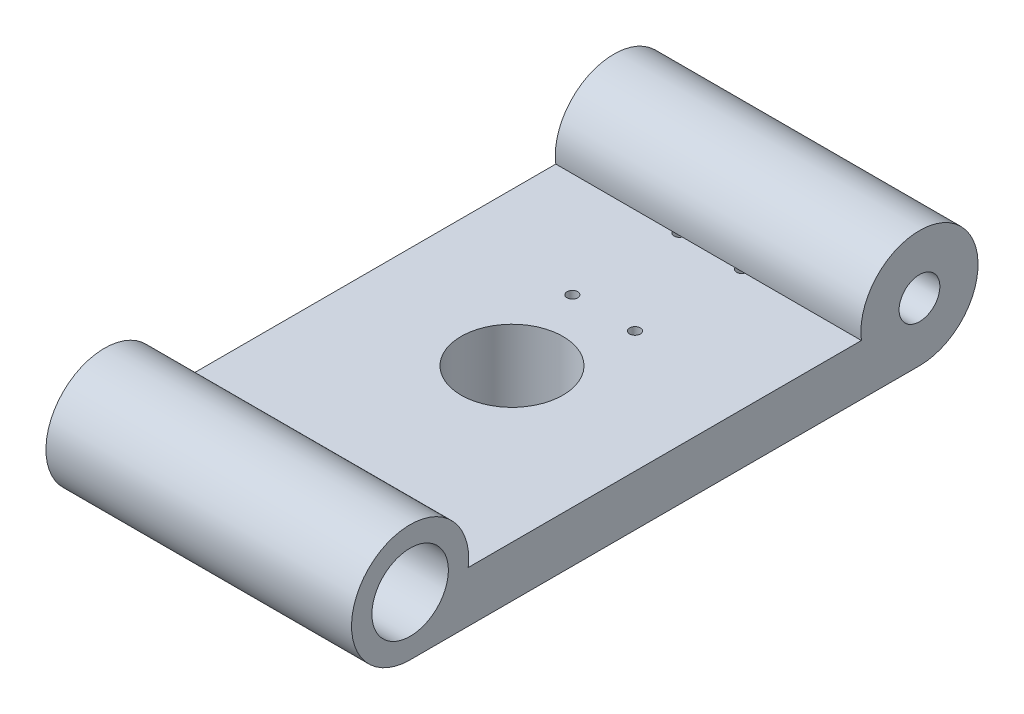
ISO-10303-21;
HEADER;
FILE_DESCRIPTION(('STEP AP214'),'2;1');
FILE_NAME('part.step','',(''),(''),'','','');
FILE_SCHEMA(('AUTOMOTIVE_DESIGN { 1 0 10303 214 1 1 1 1 }'));
ENDSEC;
DATA;
#1=APPLICATION_CONTEXT('core data for automotive mechanical design processes');
#2=APPLICATION_PROTOCOL_DEFINITION('international standard','automotive_design',2000,#1);
#3=PRODUCT_CONTEXT('',#1,'mechanical');
#4=PRODUCT('Part','Part','',(#3));
#5=PRODUCT_RELATED_PRODUCT_CATEGORY('part','',(#4));
#6=PRODUCT_DEFINITION_FORMATION('','',#4);
#7=PRODUCT_DEFINITION_CONTEXT('part definition',#1,'design');
#8=PRODUCT_DEFINITION('design','',#6,#7);
#9=PRODUCT_DEFINITION_SHAPE('','',#8);
#10=(LENGTH_UNIT() NAMED_UNIT(*) SI_UNIT(.MILLI.,.METRE.));
#11=(NAMED_UNIT(*) PLANE_ANGLE_UNIT() SI_UNIT($,.RADIAN.));
#12=(NAMED_UNIT(*) SI_UNIT($,.STERADIAN.) SOLID_ANGLE_UNIT());
#13=UNCERTAINTY_MEASURE_WITH_UNIT(LENGTH_MEASURE(1.E-05),#10,'distance_accuracy_value','');
#14=(GEOMETRIC_REPRESENTATION_CONTEXT(3) GLOBAL_UNCERTAINTY_ASSIGNED_CONTEXT((#13)) GLOBAL_UNIT_ASSIGNED_CONTEXT((#10,
#11,#12)) REPRESENTATION_CONTEXT('',''));
#15=CARTESIAN_POINT('',(0.,0.,0.));
#16=DIRECTION('',(0.,0.,1.));
#17=DIRECTION('',(1.,0.,0.));
#18=AXIS2_PLACEMENT_3D('',#15,#16,#17);
#19=CARTESIAN_POINT('',(30.,-11.5,0.));
#20=DIRECTION('',(0.,1.,0.));
#21=DIRECTION('',(0.,0.,1.));
#22=AXIS2_PLACEMENT_3D('',#19,#20,#21);
#23=PLANE('',#22);
#24=CARTESIAN_POINT('',(-6.15,-11.5,-39.));
#25=DIRECTION('',(0.,-1.,0.));
#26=DIRECTION('',(0.,0.,-1.));
#27=AXIS2_PLACEMENT_3D('',#24,#25,#26);
#28=CIRCLE('',#27,1.05);
#29=CARTESIAN_POINT('',(-6.15,-11.5,-40.05));
#30=VERTEX_POINT('',#29);
#31=EDGE_CURVE('E214',#30,#30,#28,.T.);
#32=ORIENTED_EDGE('',*,*,#31,.F.);
#33=EDGE_LOOP('',(#32));
#34=FACE_BOUND('',#33,.T.);
#35=CARTESIAN_POINT('',(6.15,-11.5,-18.));
#36=DIRECTION('',(0.,-1.,0.));
#37=DIRECTION('',(0.,0.,-1.));
#38=AXIS2_PLACEMENT_3D('',#35,#36,#37);
#39=CIRCLE('',#38,1.05);
#40=CARTESIAN_POINT('',(6.15,-11.5,-19.05));
#41=VERTEX_POINT('',#40);
#42=EDGE_CURVE('E108',#41,#41,#39,.T.);
#43=ORIENTED_EDGE('',*,*,#42,.F.);
#44=EDGE_LOOP('',(#43));
#45=FACE_BOUND('',#44,.T.);
#46=CARTESIAN_POINT('',(6.15,-11.5,-39.));
#47=DIRECTION('',(0.,-1.,0.));
#48=DIRECTION('',(0.,0.,-1.));
#49=AXIS2_PLACEMENT_3D('',#46,#47,#48);
#50=CIRCLE('',#49,1.05);
#51=CARTESIAN_POINT('',(6.15,-11.5,-40.05));
#52=VERTEX_POINT('',#51);
#53=EDGE_CURVE('E99',#52,#52,#50,.T.);
#54=ORIENTED_EDGE('',*,*,#53,.F.);
#55=EDGE_LOOP('',(#54));
#56=FACE_BOUND('',#55,.T.);
#57=CARTESIAN_POINT('',(-6.15,-11.5,-18.));
#58=DIRECTION('',(0.,-1.,0.));
#59=DIRECTION('',(0.,0.,-1.));
#60=AXIS2_PLACEMENT_3D('',#57,#58,#59);
#61=CIRCLE('',#60,1.05);
#62=CARTESIAN_POINT('',(-6.15,-11.5,-19.05));
#63=VERTEX_POINT('',#62);
#64=EDGE_CURVE('E199',#63,#63,#61,.T.);
#65=ORIENTED_EDGE('',*,*,#64,.F.);
#66=EDGE_LOOP('',(#65));
#67=FACE_BOUND('',#66,.T.);
#68=CARTESIAN_POINT('',(0.,-11.5,0.));
#69=DIRECTION('',(0.,-1.,0.));
#70=DIRECTION('',(0.,0.,-1.));
#71=AXIS2_PLACEMENT_3D('',#68,#69,#70);
#72=CIRCLE('',#71,15.);
#73=CARTESIAN_POINT('',(0.,-11.5,-15.));
#74=VERTEX_POINT('',#73);
#75=EDGE_CURVE('E164',#74,#74,#72,.T.);
#76=ORIENTED_EDGE('',*,*,#75,.F.);
#77=EDGE_LOOP('',(#76));
#78=FACE_BOUND('',#77,.T.);
#79=DIRECTION('',(0.,0.,-1.));
#80=VECTOR('',#79,1.);
#81=CARTESIAN_POINT('',(-30.,-11.5,0.));
#82=LINE('',#81,#80);
#83=CARTESIAN_POINT('',(-30.,-11.5,50.));
#84=VERTEX_POINT('',#83);
#85=CARTESIAN_POINT('',(-30.,-11.5,-50.));
#86=VERTEX_POINT('',#85);
#87=EDGE_CURVE('E152',#84,#86,#82,.T.);
#88=ORIENTED_EDGE('',*,*,#87,.T.);
#89=DIRECTION('',(-1.,0.,0.));
#90=VECTOR('',#89,1.);
#91=CARTESIAN_POINT('',(30.,-11.5,-50.));
#92=LINE('',#91,#90);
#93=CARTESIAN_POINT('',(30.,-11.5,-50.));
#94=VERTEX_POINT('',#93);
#95=EDGE_CURVE('E11',#94,#86,#92,.T.);
#96=ORIENTED_EDGE('',*,*,#95,.F.);
#97=DIRECTION('',(0.,0.,-1.));
#98=VECTOR('',#97,1.);
#99=CARTESIAN_POINT('',(30.,-11.5,0.));
#100=LINE('',#99,#98);
#101=CARTESIAN_POINT('',(30.,-11.5,50.));
#102=VERTEX_POINT('',#101);
#103=EDGE_CURVE('E172',#102,#94,#100,.T.);
#104=ORIENTED_EDGE('',*,*,#103,.F.);
#105=DIRECTION('',(-1.,0.,0.));
#106=VECTOR('',#105,1.);
#107=CARTESIAN_POINT('',(30.,-11.5,50.));
#108=LINE('',#107,#106);
#109=EDGE_CURVE('E132',#102,#84,#108,.T.);
#110=ORIENTED_EDGE('',*,*,#109,.T.);
#111=EDGE_LOOP('',(#88,#96,#104,#110));
#112=FACE_BOUND('',#111,.T.);
#113=ADVANCED_FACE('F41',(#34,#45,#56,#67,#78,#112),#23,.F.);
#114=CARTESIAN_POINT('',(30.,0.,-50.));
#115=DIRECTION('',(-1.,0.,0.));
#116=DIRECTION('',(0.,0.,1.));
#117=AXIS2_PLACEMENT_3D('',#114,#115,#116);
#118=CYLINDRICAL_SURFACE('',#117,11.5);
#119=CARTESIAN_POINT('',(-30.,0.,-50.));
#120=DIRECTION('',(1.,0.,0.));
#121=DIRECTION('',(0.,0.,-1.));
#122=AXIS2_PLACEMENT_3D('',#119,#120,#121);
#123=CIRCLE('',#122,11.5);
#124=CARTESIAN_POINT('',(-30.,-1.5,-38.5982457490086));
#125=VERTEX_POINT('',#124);
#126=EDGE_CURVE('E149',#86,#125,#123,.T.);
#127=ORIENTED_EDGE('',*,*,#126,.T.);
#128=DIRECTION('',(-1.,0.,0.));
#129=VECTOR('',#128,1.);
#130=CARTESIAN_POINT('',(30.,-1.5,-38.5982457490086));
#131=LINE('',#130,#129);
#132=CARTESIAN_POINT('',(-7.12009974838176,-1.5,-38.5982457490086));
#133=VERTEX_POINT('',#132);
#134=EDGE_CURVE('E123',#133,#125,#131,.T.);
#135=ORIENTED_EDGE('',*,*,#134,.F.);
#136=CARTESIAN_POINT('',(-5.17990025161823,-1.5,-38.5982457490086));
#137=VERTEX_POINT('',#136);
#138=EDGE_CURVE('E126',#137,#133,#131,.T.);
#139=ORIENTED_EDGE('',*,*,#138,.F.);
#140=CARTESIAN_POINT('',(5.17990025161824,-1.5,-38.5982457490086));
#141=VERTEX_POINT('',#140);
#142=EDGE_CURVE('E115',#141,#137,#131,.T.);
#143=ORIENTED_EDGE('',*,*,#142,.F.);
#144=CARTESIAN_POINT('',(7.12009974838177,-1.5,-38.5982457490086));
#145=VERTEX_POINT('',#144);
#146=EDGE_CURVE('E95',#145,#141,#131,.T.);
#147=ORIENTED_EDGE('',*,*,#146,.F.);
#148=CARTESIAN_POINT('',(30.,-1.5,-38.5982457490086));
#149=VERTEX_POINT('',#148);
#150=EDGE_CURVE('E50',#149,#145,#131,.T.);
#151=ORIENTED_EDGE('',*,*,#150,.F.);
#152=CARTESIAN_POINT('',(30.,0.,-50.));
#153=DIRECTION('',(1.,0.,0.));
#154=DIRECTION('',(0.,0.,-1.));
#155=AXIS2_PLACEMENT_3D('',#152,#153,#154);
#156=CIRCLE('',#155,11.5);
#157=EDGE_CURVE('E169',#94,#149,#156,.T.);
#158=ORIENTED_EDGE('',*,*,#157,.F.);
#159=ORIENTED_EDGE('',*,*,#95,.T.);
#160=EDGE_LOOP('',(#127,#135,#139,#143,#147,#151,#158,#159));
#161=FACE_BOUND('',#160,.T.);
#162=ADVANCED_FACE('F112',(#161),#118,.T.);
#163=CARTESIAN_POINT('',(30.,-1.5,0.));
#164=DIRECTION('',(0.,1.,0.));
#165=DIRECTION('',(0.,0.,1.));
#166=AXIS2_PLACEMENT_3D('',#163,#164,#165);
#167=PLANE('',#166);
#168=CARTESIAN_POINT('',(-6.15,-1.5,-39.));
#169=DIRECTION('',(0.,-1.,0.));
#170=DIRECTION('',(0.,0.,-1.));
#171=AXIS2_PLACEMENT_3D('',#168,#169,#170);
#172=CIRCLE('',#171,1.05);
#173=EDGE_CURVE('E203',#137,#133,#172,.T.);
#174=ORIENTED_EDGE('',*,*,#173,.T.);
#175=ORIENTED_EDGE('',*,*,#134,.T.);
#176=DIRECTION('',(0.,0.,-1.));
#177=VECTOR('',#176,1.);
#178=CARTESIAN_POINT('',(-30.,-1.5,0.));
#179=LINE('',#178,#177);
#180=CARTESIAN_POINT('',(-30.,-1.5,38.5982457490086));
#181=VERTEX_POINT('',#180);
#182=EDGE_CURVE('E145',#181,#125,#179,.T.);
#183=ORIENTED_EDGE('',*,*,#182,.F.);
#184=DIRECTION('',(-1.,0.,0.));
#185=VECTOR('',#184,1.);
#186=CARTESIAN_POINT('',(30.,-1.5,38.5982457490086));
#187=LINE('',#186,#185);
#188=CARTESIAN_POINT('',(30.,-1.5,38.5982457490086));
#189=VERTEX_POINT('',#188);
#190=EDGE_CURVE('E127',#189,#181,#187,.T.);
#191=ORIENTED_EDGE('',*,*,#190,.F.);
#192=DIRECTION('',(0.,0.,-1.));
#193=VECTOR('',#192,1.);
#194=CARTESIAN_POINT('',(30.,-1.5,0.));
#195=LINE('',#194,#193);
#196=EDGE_CURVE('E121',#189,#149,#195,.T.);
#197=ORIENTED_EDGE('',*,*,#196,.T.);
#198=ORIENTED_EDGE('',*,*,#150,.T.);
#199=CARTESIAN_POINT('',(6.15,-1.5,-39.));
#200=DIRECTION('',(0.,-1.,0.));
#201=DIRECTION('',(0.,0.,-1.));
#202=AXIS2_PLACEMENT_3D('',#199,#200,#201);
#203=CIRCLE('',#202,1.05);
#204=EDGE_CURVE('E98',#145,#141,#203,.T.);
#205=ORIENTED_EDGE('',*,*,#204,.T.);
#206=ORIENTED_EDGE('',*,*,#142,.T.);
#207=EDGE_LOOP('',(#174,#175,#183,#191,#197,#198,#205,#206));
#208=FACE_BOUND('',#207,.T.);
#209=CARTESIAN_POINT('',(6.15,-1.5,-18.));
#210=DIRECTION('',(0.,-1.,0.));
#211=DIRECTION('',(0.,0.,-1.));
#212=AXIS2_PLACEMENT_3D('',#209,#210,#211);
#213=CIRCLE('',#212,1.05);
#214=CARTESIAN_POINT('',(6.15,-1.5,-19.05));
#215=VERTEX_POINT('',#214);
#216=EDGE_CURVE('E210',#215,#215,#213,.T.);
#217=ORIENTED_EDGE('',*,*,#216,.T.);
#218=EDGE_LOOP('',(#217));
#219=FACE_BOUND('',#218,.T.);
#220=CARTESIAN_POINT('',(-6.15,-1.5,-18.));
#221=DIRECTION('',(0.,-1.,0.));
#222=DIRECTION('',(0.,0.,-1.));
#223=AXIS2_PLACEMENT_3D('',#220,#221,#222);
#224=CIRCLE('',#223,1.05);
#225=CARTESIAN_POINT('',(-6.15,-1.5,-19.05));
#226=VERTEX_POINT('',#225);
#227=EDGE_CURVE('E195',#226,#226,#224,.T.);
#228=ORIENTED_EDGE('',*,*,#227,.T.);
#229=EDGE_LOOP('',(#228));
#230=FACE_BOUND('',#229,.T.);
#231=CARTESIAN_POINT('',(0.,-1.5,0.));
#232=DIRECTION('',(0.,1.,0.));
#233=DIRECTION('',(0.,0.,1.));
#234=AXIS2_PLACEMENT_3D('',#231,#232,#233);
#235=CIRCLE('',#234,10.);
#236=CARTESIAN_POINT('',(0.,-1.5,10.));
#237=VERTEX_POINT('',#236);
#238=EDGE_CURVE('E191',#237,#237,#235,.T.);
#239=ORIENTED_EDGE('',*,*,#238,.F.);
#240=EDGE_LOOP('',(#239));
#241=FACE_BOUND('',#240,.T.);
#242=ADVANCED_FACE('F118',(#208,#219,#230,#241),#167,.T.);
#243=CARTESIAN_POINT('',(30.,0.,-50.));
#244=DIRECTION('',(-1.,0.,0.));
#245=DIRECTION('',(0.,0.,1.));
#246=AXIS2_PLACEMENT_3D('',#243,#244,#245);
#247=CYLINDRICAL_SURFACE('',#246,4.00000000000001);
#248=CARTESIAN_POINT('',(30.,0.,-50.));
#249=DIRECTION('',(1.,0.,0.));
#250=DIRECTION('',(0.,0.,-1.));
#251=AXIS2_PLACEMENT_3D('',#248,#249,#250);
#252=CIRCLE('',#251,4.00000000000001);
#253=CARTESIAN_POINT('',(30.,0.,-46.));
#254=VERTEX_POINT('',#253);
#255=EDGE_CURVE('E176',#254,#254,#252,.T.);
#256=CARTESIAN_POINT('',(-30.,0.,-50.));
#257=DIRECTION('',(1.,0.,0.));
#258=DIRECTION('',(0.,0.,-1.));
#259=AXIS2_PLACEMENT_3D('',#256,#257,#258);
#260=CIRCLE('',#259,4.00000000000001);
#261=CARTESIAN_POINT('',(-30.,0.,-46.));
#262=VERTEX_POINT('',#261);
#263=EDGE_CURVE('E156',#262,#262,#260,.T.);
#264=CARTESIAN_POINT('',(30.,0.,-46.));
#265=CARTESIAN_POINT('',(29.375,0.,-46.));
#266=CARTESIAN_POINT('',(28.75,0.,-46.));
#267=CARTESIAN_POINT('',(27.5,0.,-46.));
#268=CARTESIAN_POINT('',(26.875,0.,-46.));
#269=CARTESIAN_POINT('',(25.625,0.,-46.));
#270=CARTESIAN_POINT('',(25.,0.,-46.));
#271=CARTESIAN_POINT('',(23.75,0.,-46.));
#272=CARTESIAN_POINT('',(23.125,0.,-46.));
#273=CARTESIAN_POINT('',(21.875,0.,-46.));
#274=CARTESIAN_POINT('',(21.25,0.,-46.));
#275=CARTESIAN_POINT('',(20.,0.,-46.));
#276=CARTESIAN_POINT('',(19.375,0.,-46.));
#277=CARTESIAN_POINT('',(18.125,0.,-46.));
#278=CARTESIAN_POINT('',(17.5,0.,-46.));
#279=CARTESIAN_POINT('',(16.25,0.,-46.));
#280=CARTESIAN_POINT('',(15.625,0.,-46.));
#281=CARTESIAN_POINT('',(14.375,0.,-46.));
#282=CARTESIAN_POINT('',(13.75,0.,-46.));
#283=CARTESIAN_POINT('',(12.5,0.,-46.));
#284=CARTESIAN_POINT('',(11.875,0.,-46.));
#285=CARTESIAN_POINT('',(10.625,0.,-46.));
#286=CARTESIAN_POINT('',(10.,0.,-46.));
#287=CARTESIAN_POINT('',(8.75,0.,-46.));
#288=CARTESIAN_POINT('',(8.125,0.,-46.));
#289=CARTESIAN_POINT('',(6.875,0.,-46.));
#290=CARTESIAN_POINT('',(6.25,0.,-46.));
#291=CARTESIAN_POINT('',(5.,0.,-46.));
#292=CARTESIAN_POINT('',(4.375,0.,-46.));
#293=CARTESIAN_POINT('',(3.125,0.,-46.));
#294=CARTESIAN_POINT('',(2.5,0.,-46.));
#295=CARTESIAN_POINT('',(1.25,0.,-46.));
#296=CARTESIAN_POINT('',(0.624999999999997,0.,-46.));
#297=CARTESIAN_POINT('',(-0.625000000000002,0.,-46.));
#298=CARTESIAN_POINT('',(-1.25,0.,-46.));
#299=CARTESIAN_POINT('',(-2.5,0.,-46.));
#300=CARTESIAN_POINT('',(-3.125,0.,-46.));
#301=CARTESIAN_POINT('',(-4.375,0.,-46.));
#302=CARTESIAN_POINT('',(-5.,0.,-46.));
#303=CARTESIAN_POINT('',(-6.25,0.,-46.));
#304=CARTESIAN_POINT('',(-6.875,0.,-46.));
#305=CARTESIAN_POINT('',(-8.125,0.,-46.));
#306=CARTESIAN_POINT('',(-8.75,0.,-46.));
#307=CARTESIAN_POINT('',(-10.,0.,-46.));
#308=CARTESIAN_POINT('',(-10.625,0.,-46.));
#309=CARTESIAN_POINT('',(-11.875,0.,-46.));
#310=CARTESIAN_POINT('',(-12.5,0.,-46.));
#311=CARTESIAN_POINT('',(-13.75,0.,-46.));
#312=CARTESIAN_POINT('',(-14.375,0.,-46.));
#313=CARTESIAN_POINT('',(-15.625,0.,-46.));
#314=CARTESIAN_POINT('',(-16.25,0.,-46.));
#315=CARTESIAN_POINT('',(-17.5,0.,-46.));
#316=CARTESIAN_POINT('',(-18.125,0.,-46.));
#317=CARTESIAN_POINT('',(-19.375,0.,-46.));
#318=CARTESIAN_POINT('',(-20.,0.,-46.));
#319=CARTESIAN_POINT('',(-21.25,0.,-46.));
#320=CARTESIAN_POINT('',(-21.875,0.,-46.));
#321=CARTESIAN_POINT('',(-23.125,0.,-46.));
#322=CARTESIAN_POINT('',(-23.75,0.,-46.));
#323=CARTESIAN_POINT('',(-25.,0.,-46.));
#324=CARTESIAN_POINT('',(-25.625,0.,-46.));
#325=CARTESIAN_POINT('',(-26.875,0.,-46.));
#326=CARTESIAN_POINT('',(-27.5,0.,-46.));
#327=CARTESIAN_POINT('',(-28.75,0.,-46.));
#328=CARTESIAN_POINT('',(-29.375,0.,-46.));
#329=CARTESIAN_POINT('',(-30.,0.,-46.));
#330=B_SPLINE_CURVE_WITH_KNOTS('',3,(#264,#265,#266,#267,#268,#269,#270,#271,#272,#273,#274,
#275,#276,#277,#278,#279,#280,#281,#282,#283,#284,#285,#286,#287,#288,#289,#290,#291,#292,#293,
#294,#295,#296,#297,#298,#299,#300,#301,#302,#303,#304,#305,#306,#307,#308,#309,#310,#311,#312,
#313,#314,#315,#316,#317,#318,#319,#320,#321,#322,#323,#324,#325,#326,#327,#328,#329),
.UNSPECIFIED.,.F.,.F.,(4,2,2,2,2,2,2,2,2,2,2,2,2,2,2,2,2,2,2,2,2,2,2,2,2,2,2,2,2,2,2,2,4),(0.,
1.875,3.75,5.625,7.5,9.375,11.25,13.125,15.,16.875,18.75,20.625,22.5,24.375,26.25,28.125,30.,
31.875,33.75,35.625,37.5,39.375,41.25,43.125,45.,46.875,48.75,50.625,52.5,54.375,56.25,58.125,
60.),.UNSPECIFIED.);
#331=EDGE_CURVE('BSEAM249',#254,#262,#330,.T.);
#332=ORIENTED_EDGE('',*,*,#255,.T.);
#333=ORIENTED_EDGE('',*,*,#263,.F.);
#334=ORIENTED_EDGE('',*,*,#331,.T.);
#335=ORIENTED_EDGE('',*,*,#331,.F.);
#336=EDGE_LOOP('',(#332,#334,#333,#335));
#337=FACE_BOUND('',#336,.T.);
#338=ADVANCED_FACE('F249',(#337),#247,.F.);
#339=CARTESIAN_POINT('',(30.,0.,50.));
#340=DIRECTION('',(-1.,0.,0.));
#341=DIRECTION('',(0.,0.,1.));
#342=AXIS2_PLACEMENT_3D('',#339,#340,#341);
#343=CYLINDRICAL_SURFACE('',#342,7.5);
#344=CARTESIAN_POINT('',(30.,0.,50.));
#345=DIRECTION('',(1.,0.,0.));
#346=DIRECTION('',(0.,0.,-1.));
#347=AXIS2_PLACEMENT_3D('',#344,#345,#346);
#348=CIRCLE('',#347,7.5);
#349=CARTESIAN_POINT('',(30.,0.,57.5));
#350=VERTEX_POINT('',#349);
#351=EDGE_CURVE('E144',#350,#350,#348,.T.);
#352=CARTESIAN_POINT('',(-30.,0.,50.));
#353=DIRECTION('',(1.,0.,0.));
#354=DIRECTION('',(0.,0.,-1.));
#355=AXIS2_PLACEMENT_3D('',#352,#353,#354);
#356=CIRCLE('',#355,7.5);
#357=CARTESIAN_POINT('',(-30.,0.,57.5));
#358=VERTEX_POINT('',#357);
#359=EDGE_CURVE('E160',#358,#358,#356,.T.);
#360=CARTESIAN_POINT('',(30.,0.,57.5));
#361=CARTESIAN_POINT('',(29.375,0.,57.5));
#362=CARTESIAN_POINT('',(28.75,0.,57.5));
#363=CARTESIAN_POINT('',(27.5,0.,57.5));
#364=CARTESIAN_POINT('',(26.875,0.,57.5));
#365=CARTESIAN_POINT('',(25.625,0.,57.5));
#366=CARTESIAN_POINT('',(25.,0.,57.5));
#367=CARTESIAN_POINT('',(23.75,0.,57.5));
#368=CARTESIAN_POINT('',(23.125,0.,57.5));
#369=CARTESIAN_POINT('',(21.875,0.,57.5));
#370=CARTESIAN_POINT('',(21.25,0.,57.5));
#371=CARTESIAN_POINT('',(20.,0.,57.5));
#372=CARTESIAN_POINT('',(19.375,0.,57.5));
#373=CARTESIAN_POINT('',(18.125,0.,57.5));
#374=CARTESIAN_POINT('',(17.5,0.,57.5));
#375=CARTESIAN_POINT('',(16.25,0.,57.5));
#376=CARTESIAN_POINT('',(15.625,0.,57.5));
#377=CARTESIAN_POINT('',(14.375,0.,57.5));
#378=CARTESIAN_POINT('',(13.75,0.,57.5));
#379=CARTESIAN_POINT('',(12.5,0.,57.5));
#380=CARTESIAN_POINT('',(11.875,0.,57.5));
#381=CARTESIAN_POINT('',(10.625,0.,57.5));
#382=CARTESIAN_POINT('',(10.,0.,57.5));
#383=CARTESIAN_POINT('',(8.75,0.,57.5));
#384=CARTESIAN_POINT('',(8.125,0.,57.5));
#385=CARTESIAN_POINT('',(6.875,0.,57.5));
#386=CARTESIAN_POINT('',(6.25,0.,57.5));
#387=CARTESIAN_POINT('',(5.,0.,57.5));
#388=CARTESIAN_POINT('',(4.375,0.,57.5));
#389=CARTESIAN_POINT('',(3.125,0.,57.5));
#390=CARTESIAN_POINT('',(2.5,0.,57.5));
#391=CARTESIAN_POINT('',(1.25,0.,57.5));
#392=CARTESIAN_POINT('',(0.625,0.,57.5));
#393=CARTESIAN_POINT('',(-0.624999999999999,0.,57.5));
#394=CARTESIAN_POINT('',(-1.25,0.,57.5));
#395=CARTESIAN_POINT('',(-2.5,0.,57.5));
#396=CARTESIAN_POINT('',(-3.125,0.,57.5));
#397=CARTESIAN_POINT('',(-4.375,0.,57.5));
#398=CARTESIAN_POINT('',(-5.,0.,57.5));
#399=CARTESIAN_POINT('',(-6.25,0.,57.5));
#400=CARTESIAN_POINT('',(-6.875,0.,57.5));
#401=CARTESIAN_POINT('',(-8.125,0.,57.5));
#402=CARTESIAN_POINT('',(-8.75,0.,57.5));
#403=CARTESIAN_POINT('',(-10.,0.,57.5));
#404=CARTESIAN_POINT('',(-10.625,0.,57.5));
#405=CARTESIAN_POINT('',(-11.875,0.,57.5));
#406=CARTESIAN_POINT('',(-12.5,0.,57.5));
#407=CARTESIAN_POINT('',(-13.75,0.,57.5));
#408=CARTESIAN_POINT('',(-14.375,0.,57.5));
#409=CARTESIAN_POINT('',(-15.625,0.,57.5));
#410=CARTESIAN_POINT('',(-16.25,0.,57.5));
#411=CARTESIAN_POINT('',(-17.5,0.,57.5));
#412=CARTESIAN_POINT('',(-18.125,0.,57.5));
#413=CARTESIAN_POINT('',(-19.375,0.,57.5));
#414=CARTESIAN_POINT('',(-20.,0.,57.5));
#415=CARTESIAN_POINT('',(-21.25,0.,57.5));
#416=CARTESIAN_POINT('',(-21.875,0.,57.5));
#417=CARTESIAN_POINT('',(-23.125,0.,57.5));
#418=CARTESIAN_POINT('',(-23.75,0.,57.5));
#419=CARTESIAN_POINT('',(-25.,0.,57.5));
#420=CARTESIAN_POINT('',(-25.625,0.,57.5));
#421=CARTESIAN_POINT('',(-26.875,0.,57.5));
#422=CARTESIAN_POINT('',(-27.5,0.,57.5));
#423=CARTESIAN_POINT('',(-28.75,0.,57.5));
#424=CARTESIAN_POINT('',(-29.375,0.,57.5));
#425=CARTESIAN_POINT('',(-30.,0.,57.5));
#426=B_SPLINE_CURVE_WITH_KNOTS('',3,(#360,#361,#362,#363,#364,#365,#366,#367,#368,#369,#370,
#371,#372,#373,#374,#375,#376,#377,#378,#379,#380,#381,#382,#383,#384,#385,#386,#387,#388,#389,
#390,#391,#392,#393,#394,#395,#396,#397,#398,#399,#400,#401,#402,#403,#404,#405,#406,#407,#408,
#409,#410,#411,#412,#413,#414,#415,#416,#417,#418,#419,#420,#421,#422,#423,#424,#425),
.UNSPECIFIED.,.F.,.F.,(4,2,2,2,2,2,2,2,2,2,2,2,2,2,2,2,2,2,2,2,2,2,2,2,2,2,2,2,2,2,2,2,4),(0.,
1.875,3.75,5.625,7.5,9.375,11.25,13.125,15.,16.875,18.75,20.625,22.5,24.375,26.25,28.125,30.,
31.875,33.75,35.625,37.5,39.375,41.25,43.125,45.,46.875,48.75,50.625,52.5,54.375,56.25,58.125,
60.),.UNSPECIFIED.);
#427=EDGE_CURVE('BSEAM43',#350,#358,#426,.T.);
#428=ORIENTED_EDGE('',*,*,#351,.T.);
#429=ORIENTED_EDGE('',*,*,#359,.F.);
#430=ORIENTED_EDGE('',*,*,#427,.T.);
#431=ORIENTED_EDGE('',*,*,#427,.F.);
#432=EDGE_LOOP('',(#428,#430,#429,#431));
#433=FACE_BOUND('',#432,.T.);
#434=ADVANCED_FACE('F43',(#433),#343,.F.);
#435=CARTESIAN_POINT('',(30.,0.,50.));
#436=DIRECTION('',(-1.,0.,0.));
#437=DIRECTION('',(0.,0.,1.));
#438=AXIS2_PLACEMENT_3D('',#435,#436,#437);
#439=CYLINDRICAL_SURFACE('',#438,11.5);
#440=CARTESIAN_POINT('',(-30.,0.,50.));
#441=DIRECTION('',(1.,0.,0.));
#442=DIRECTION('',(0.,0.,-1.));
#443=AXIS2_PLACEMENT_3D('',#440,#441,#442);
#444=CIRCLE('',#443,11.5);
#445=EDGE_CURVE('E141',#181,#84,#444,.T.);
#446=ORIENTED_EDGE('',*,*,#445,.T.);
#447=ORIENTED_EDGE('',*,*,#109,.F.);
#448=CARTESIAN_POINT('',(30.,0.,50.));
#449=DIRECTION('',(1.,0.,0.));
#450=DIRECTION('',(0.,0.,-1.));
#451=AXIS2_PLACEMENT_3D('',#448,#449,#450);
#452=CIRCLE('',#451,11.5);
#453=EDGE_CURVE('E138',#189,#102,#452,.T.);
#454=ORIENTED_EDGE('',*,*,#453,.F.);
#455=ORIENTED_EDGE('',*,*,#190,.T.);
#456=EDGE_LOOP('',(#446,#447,#454,#455));
#457=FACE_BOUND('',#456,.T.);
#458=ADVANCED_FACE('F240',(#457),#439,.T.);
#459=CARTESIAN_POINT('',(30.,0.,0.));
#460=DIRECTION('',(1.,0.,0.));
#461=DIRECTION('',(0.,0.,-1.));
#462=AXIS2_PLACEMENT_3D('',#459,#460,#461);
#463=PLANE('',#462);
#464=ORIENTED_EDGE('',*,*,#351,.F.);
#465=EDGE_LOOP('',(#464));
#466=FACE_BOUND('',#465,.T.);
#467=ORIENTED_EDGE('',*,*,#255,.F.);
#468=EDGE_LOOP('',(#467));
#469=FACE_BOUND('',#468,.T.);
#470=ORIENTED_EDGE('',*,*,#103,.T.);
#471=ORIENTED_EDGE('',*,*,#157,.T.);
#472=ORIENTED_EDGE('',*,*,#196,.F.);
#473=ORIENTED_EDGE('',*,*,#453,.T.);
#474=EDGE_LOOP('',(#470,#471,#472,#473));
#475=FACE_BOUND('',#474,.T.);
#476=ADVANCED_FACE('F239',(#466,#469,#475),#463,.T.);
#477=CARTESIAN_POINT('',(-30.,0.,0.));
#478=DIRECTION('',(1.,0.,0.));
#479=DIRECTION('',(0.,0.,-1.));
#480=AXIS2_PLACEMENT_3D('',#477,#478,#479);
#481=PLANE('',#480);
#482=ORIENTED_EDGE('',*,*,#359,.T.);
#483=EDGE_LOOP('',(#482));
#484=FACE_BOUND('',#483,.T.);
#485=ORIENTED_EDGE('',*,*,#263,.T.);
#486=EDGE_LOOP('',(#485));
#487=FACE_BOUND('',#486,.T.);
#488=ORIENTED_EDGE('',*,*,#87,.F.);
#489=ORIENTED_EDGE('',*,*,#445,.F.);
#490=ORIENTED_EDGE('',*,*,#182,.T.);
#491=ORIENTED_EDGE('',*,*,#126,.F.);
#492=EDGE_LOOP('',(#488,#489,#490,#491));
#493=FACE_BOUND('',#492,.T.);
#494=ADVANCED_FACE('F237',(#484,#487,#493),#481,.F.);
#495=CARTESIAN_POINT('',(0.,-24.,0.));
#496=DIRECTION('',(0.,-1.,0.));
#497=DIRECTION('',(0.,0.,-1.));
#498=AXIS2_PLACEMENT_3D('',#495,#496,#497);
#499=CYLINDRICAL_SURFACE('',#498,15.);
#500=ORIENTED_EDGE('',*,*,#75,.T.);
#501=EDGE_LOOP('',(#500));
#502=FACE_BOUND('',#501,.T.);
#503=CARTESIAN_POINT('',(0.,-24.,0.));
#504=DIRECTION('',(0.,-1.,0.));
#505=DIRECTION('',(0.,0.,-1.));
#506=AXIS2_PLACEMENT_3D('',#503,#504,#505);
#507=CIRCLE('',#506,15.);
#508=CARTESIAN_POINT('',(0.,-24.,-15.));
#509=VERTEX_POINT('',#508);
#510=EDGE_CURVE('E186',#509,#509,#507,.T.);
#511=ORIENTED_EDGE('',*,*,#510,.F.);
#512=EDGE_LOOP('',(#511));
#513=FACE_BOUND('',#512,.T.);
#514=ADVANCED_FACE('F265',(#502,#513),#499,.T.);
#515=CARTESIAN_POINT('',(0.,-24.,-15.));
#516=DIRECTION('',(0.,-1.,0.));
#517=DIRECTION('',(0.,0.,-1.));
#518=AXIS2_PLACEMENT_3D('',#515,#516,#517);
#519=PLANE('',#518);
#520=CARTESIAN_POINT('',(0.,-24.,0.));
#521=DIRECTION('',(0.,1.,0.));
#522=DIRECTION('',(0.,0.,1.));
#523=AXIS2_PLACEMENT_3D('',#520,#521,#522);
#524=CIRCLE('',#523,10.);
#525=CARTESIAN_POINT('',(0.,-24.,10.));
#526=VERTEX_POINT('',#525);
#527=EDGE_CURVE('E190',#526,#526,#524,.T.);
#528=ORIENTED_EDGE('',*,*,#527,.T.);
#529=EDGE_LOOP('',(#528));
#530=FACE_BOUND('',#529,.T.);
#531=ORIENTED_EDGE('',*,*,#510,.T.);
#532=EDGE_LOOP('',(#531));
#533=FACE_BOUND('',#532,.T.);
#534=ADVANCED_FACE('F270',(#530,#533),#519,.T.);
#535=CARTESIAN_POINT('',(0.,-24.,0.));
#536=DIRECTION('',(0.,1.,0.));
#537=DIRECTION('',(0.,0.,1.));
#538=AXIS2_PLACEMENT_3D('',#535,#536,#537);
#539=CYLINDRICAL_SURFACE('',#538,10.);
#540=CARTESIAN_POINT('',(0.,-24.,10.));
#541=CARTESIAN_POINT('',(0.,-23.765625,10.));
#542=CARTESIAN_POINT('',(0.,-23.53125,10.));
#543=CARTESIAN_POINT('',(0.,-23.0625,10.));
#544=CARTESIAN_POINT('',(0.,-22.828125,10.));
#545=CARTESIAN_POINT('',(0.,-22.359375,10.));
#546=CARTESIAN_POINT('',(0.,-22.125,10.));
#547=CARTESIAN_POINT('',(0.,-21.65625,10.));
#548=CARTESIAN_POINT('',(0.,-21.421875,10.));
#549=CARTESIAN_POINT('',(0.,-20.953125,10.));
#550=CARTESIAN_POINT('',(0.,-20.71875,10.));
#551=CARTESIAN_POINT('',(0.,-20.25,10.));
#552=CARTESIAN_POINT('',(0.,-20.015625,10.));
#553=CARTESIAN_POINT('',(0.,-19.546875,10.));
#554=CARTESIAN_POINT('',(0.,-19.3125,10.));
#555=CARTESIAN_POINT('',(0.,-18.84375,10.));
#556=CARTESIAN_POINT('',(0.,-18.609375,10.));
#557=CARTESIAN_POINT('',(0.,-18.140625,10.));
#558=CARTESIAN_POINT('',(0.,-17.90625,10.));
#559=CARTESIAN_POINT('',(0.,-17.4375,10.));
#560=CARTESIAN_POINT('',(0.,-17.203125,10.));
#561=CARTESIAN_POINT('',(0.,-16.734375,10.));
#562=CARTESIAN_POINT('',(0.,-16.5,10.));
#563=CARTESIAN_POINT('',(0.,-16.03125,10.));
#564=CARTESIAN_POINT('',(0.,-15.796875,10.));
#565=CARTESIAN_POINT('',(0.,-15.328125,10.));
#566=CARTESIAN_POINT('',(0.,-15.09375,10.));
#567=CARTESIAN_POINT('',(0.,-14.625,10.));
#568=CARTESIAN_POINT('',(0.,-14.390625,10.));
#569=CARTESIAN_POINT('',(0.,-13.921875,10.));
#570=CARTESIAN_POINT('',(0.,-13.6875,10.));
#571=CARTESIAN_POINT('',(0.,-13.21875,10.));
#572=CARTESIAN_POINT('',(0.,-12.984375,10.));
#573=CARTESIAN_POINT('',(0.,-12.515625,10.));
#574=CARTESIAN_POINT('',(0.,-12.28125,10.));
#575=CARTESIAN_POINT('',(0.,-11.8125,10.));
#576=CARTESIAN_POINT('',(0.,-11.578125,10.));
#577=CARTESIAN_POINT('',(0.,-11.109375,10.));
#578=CARTESIAN_POINT('',(0.,-10.875,10.));
#579=CARTESIAN_POINT('',(0.,-10.40625,10.));
#580=CARTESIAN_POINT('',(0.,-10.171875,10.));
#581=CARTESIAN_POINT('',(0.,-9.703125,10.));
#582=CARTESIAN_POINT('',(0.,-9.46875,10.));
#583=CARTESIAN_POINT('',(0.,-9.,10.));
#584=CARTESIAN_POINT('',(0.,-8.765625,10.));
#585=CARTESIAN_POINT('',(0.,-8.296875,10.));
#586=CARTESIAN_POINT('',(0.,-8.0625,10.));
#587=CARTESIAN_POINT('',(0.,-7.59375,10.));
#588=CARTESIAN_POINT('',(0.,-7.359375,10.));
#589=CARTESIAN_POINT('',(0.,-6.890625,10.));
#590=CARTESIAN_POINT('',(0.,-6.65625,10.));
#591=CARTESIAN_POINT('',(0.,-6.1875,10.));
#592=CARTESIAN_POINT('',(0.,-5.953125,10.));
#593=CARTESIAN_POINT('',(0.,-5.484375,10.));
#594=CARTESIAN_POINT('',(0.,-5.25,10.));
#595=CARTESIAN_POINT('',(0.,-4.78125,10.));
#596=CARTESIAN_POINT('',(0.,-4.546875,10.));
#597=CARTESIAN_POINT('',(0.,-4.078125,10.));
#598=CARTESIAN_POINT('',(0.,-3.84375,10.));
#599=CARTESIAN_POINT('',(0.,-3.375,10.));
#600=CARTESIAN_POINT('',(0.,-3.140625,10.));
#601=CARTESIAN_POINT('',(0.,-2.671875,10.));
#602=CARTESIAN_POINT('',(0.,-2.4375,10.));
#603=CARTESIAN_POINT('',(0.,-1.96875,10.));
#604=CARTESIAN_POINT('',(0.,-1.734375,10.));
#605=CARTESIAN_POINT('',(0.,-1.5,10.));
#606=B_SPLINE_CURVE_WITH_KNOTS('',3,(#540,#541,#542,#543,#544,#545,#546,#547,#548,#549,#550,
#551,#552,#553,#554,#555,#556,#557,#558,#559,#560,#561,#562,#563,#564,#565,#566,#567,#568,#569,
#570,#571,#572,#573,#574,#575,#576,#577,#578,#579,#580,#581,#582,#583,#584,#585,#586,#587,#588,
#589,#590,#591,#592,#593,#594,#595,#596,#597,#598,#599,#600,#601,#602,#603,#604,#605),
.UNSPECIFIED.,.F.,.F.,(4,2,2,2,2,2,2,2,2,2,2,2,2,2,2,2,2,2,2,2,2,2,2,2,2,2,2,2,2,2,2,2,4),(0.,
0.703124999999999,1.40625,2.109375,2.8125,3.515625,4.21875,4.921875,5.625,6.328125,7.03125,
7.734375,8.4375,9.140625,9.84375,10.546875,11.25,11.953125,12.65625,13.359375,14.0625,14.765625,
15.46875,16.171875,16.875,17.578125,18.28125,18.984375,19.6875,20.390625,21.09375,21.796875,
22.5),.UNSPECIFIED.);
#607=EDGE_CURVE('BSEAM278',#526,#237,#606,.T.);
#608=ORIENTED_EDGE('',*,*,#527,.F.);
#609=ORIENTED_EDGE('',*,*,#238,.T.);
#610=ORIENTED_EDGE('',*,*,#607,.T.);
#611=ORIENTED_EDGE('',*,*,#607,.F.);
#612=EDGE_LOOP('',(#608,#610,#609,#611));
#613=FACE_BOUND('',#612,.T.);
#614=ADVANCED_FACE('F278',(#613),#539,.F.);
#615=CARTESIAN_POINT('',(-6.15,-1.5,-18.));
#616=DIRECTION('',(0.,-1.,0.));
#617=DIRECTION('',(0.,0.,-1.));
#618=AXIS2_PLACEMENT_3D('',#615,#616,#617);
#619=CYLINDRICAL_SURFACE('',#618,1.05);
#620=ORIENTED_EDGE('',*,*,#227,.F.);
#621=EDGE_LOOP('',(#620));
#622=FACE_BOUND('',#621,.T.);
#623=ORIENTED_EDGE('',*,*,#64,.T.);
#624=EDGE_LOOP('',(#623));
#625=FACE_BOUND('',#624,.T.);
#626=ADVANCED_FACE('F285',(#622,#625),#619,.F.);
#627=CARTESIAN_POINT('',(6.15,-1.5,-39.));
#628=DIRECTION('',(0.,-1.,0.));
#629=DIRECTION('',(0.,0.,-1.));
#630=AXIS2_PLACEMENT_3D('',#627,#628,#629);
#631=PLANE('',#630);
#632=ORIENTED_EDGE('',*,*,#146,.T.);
#633=EDGE_CURVE('E63',#141,#145,#203,.T.);
#634=ORIENTED_EDGE('',*,*,#633,.T.);
#635=EDGE_LOOP('',(#632,#634));
#636=FACE_BOUND('',#635,.T.);
#637=ADVANCED_FACE('F93',(#636),#631,.T.);
#638=CARTESIAN_POINT('',(6.15,-1.5,-39.));
#639=DIRECTION('',(0.,-1.,0.));
#640=DIRECTION('',(0.,0.,-1.));
#641=AXIS2_PLACEMENT_3D('',#638,#639,#640);
#642=CYLINDRICAL_SURFACE('',#641,1.05);
#643=ORIENTED_EDGE('',*,*,#204,.F.);
#644=ORIENTED_EDGE('',*,*,#633,.F.);
#645=EDGE_LOOP('',(#643,#644));
#646=FACE_BOUND('',#645,.T.);
#647=ORIENTED_EDGE('',*,*,#53,.T.);
#648=EDGE_LOOP('',(#647));
#649=FACE_BOUND('',#648,.T.);
#650=ADVANCED_FACE('F101',(#646,#649),#642,.F.);
#651=CARTESIAN_POINT('',(6.15,-1.5,-18.));
#652=DIRECTION('',(0.,-1.,0.));
#653=DIRECTION('',(0.,0.,-1.));
#654=AXIS2_PLACEMENT_3D('',#651,#652,#653);
#655=CYLINDRICAL_SURFACE('',#654,1.05);
#656=ORIENTED_EDGE('',*,*,#216,.F.);
#657=EDGE_LOOP('',(#656));
#658=FACE_BOUND('',#657,.T.);
#659=ORIENTED_EDGE('',*,*,#42,.T.);
#660=EDGE_LOOP('',(#659));
#661=FACE_BOUND('',#660,.T.);
#662=ADVANCED_FACE('F290',(#658,#661),#655,.F.);
#663=CARTESIAN_POINT('',(-6.15,-1.5,-39.));
#664=DIRECTION('',(0.,-1.,0.));
#665=DIRECTION('',(0.,0.,-1.));
#666=AXIS2_PLACEMENT_3D('',#663,#664,#665);
#667=PLANE('',#666);
#668=ORIENTED_EDGE('',*,*,#138,.T.);
#669=EDGE_CURVE('E56',#133,#137,#172,.T.);
#670=ORIENTED_EDGE('',*,*,#669,.T.);
#671=EDGE_LOOP('',(#668,#670));
#672=FACE_BOUND('',#671,.T.);
#673=ADVANCED_FACE('F293',(#672),#667,.T.);
#674=CARTESIAN_POINT('',(-6.15,-1.5,-39.));
#675=DIRECTION('',(0.,-1.,0.));
#676=DIRECTION('',(0.,0.,-1.));
#677=AXIS2_PLACEMENT_3D('',#674,#675,#676);
#678=CYLINDRICAL_SURFACE('',#677,1.05);
#679=ORIENTED_EDGE('',*,*,#173,.F.);
#680=ORIENTED_EDGE('',*,*,#669,.F.);
#681=EDGE_LOOP('',(#679,#680));
#682=FACE_BOUND('',#681,.T.);
#683=ORIENTED_EDGE('',*,*,#31,.T.);
#684=EDGE_LOOP('',(#683));
#685=FACE_BOUND('',#684,.T.);
#686=ADVANCED_FACE('F295',(#682,#685),#678,.F.);
#687=CLOSED_SHELL('',(#113,#162,#242,#338,#434,#458,#476,#494,#514,#534,#614,#626,#637,#650,
#662,#673,#686));
#688=MANIFOLD_SOLID_BREP('B2',#687);
#689=ADVANCED_BREP_SHAPE_REPRESENTATION('',(#18,#688),#14);
#690=SHAPE_DEFINITION_REPRESENTATION(#9,#689);
ENDSEC;
END-ISO-10303-21;
